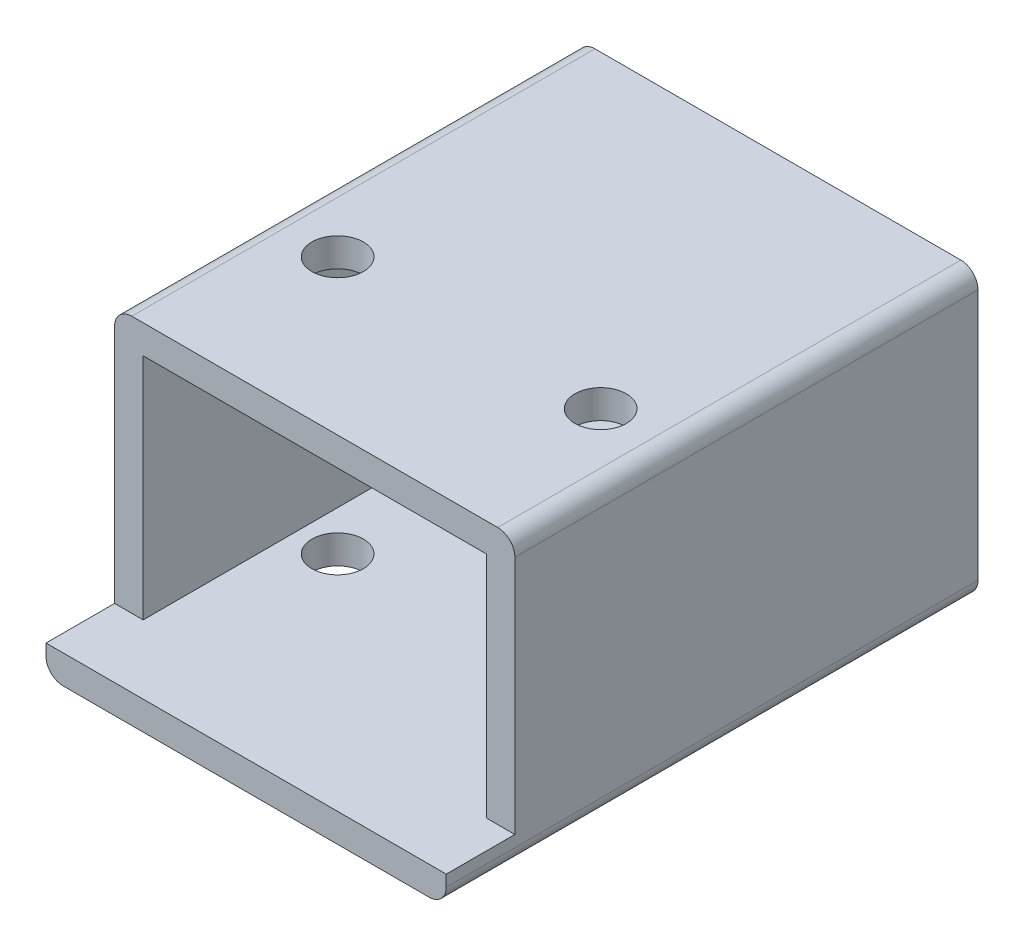
ISO-10303-21;
HEADER;
FILE_DESCRIPTION(('STEP AP214'),'2;1');
FILE_NAME('part.step','',(''),(''),'','','');
FILE_SCHEMA(('AUTOMOTIVE_DESIGN { 1 0 10303 214 1 1 1 1 }'));
ENDSEC;
DATA;
#1=APPLICATION_CONTEXT('core data for automotive mechanical design processes');
#2=APPLICATION_PROTOCOL_DEFINITION('international standard','automotive_design',2000,#1);
#3=PRODUCT_CONTEXT('',#1,'mechanical');
#4=PRODUCT('Part','Part','',(#3));
#5=PRODUCT_RELATED_PRODUCT_CATEGORY('part','',(#4));
#6=PRODUCT_DEFINITION_FORMATION('','',#4);
#7=PRODUCT_DEFINITION_CONTEXT('part definition',#1,'design');
#8=PRODUCT_DEFINITION('design','',#6,#7);
#9=PRODUCT_DEFINITION_SHAPE('','',#8);
#10=(LENGTH_UNIT() NAMED_UNIT(*) SI_UNIT(.MILLI.,.METRE.));
#11=(NAMED_UNIT(*) PLANE_ANGLE_UNIT() SI_UNIT($,.RADIAN.));
#12=(NAMED_UNIT(*) SI_UNIT($,.STERADIAN.) SOLID_ANGLE_UNIT());
#13=UNCERTAINTY_MEASURE_WITH_UNIT(LENGTH_MEASURE(1.E-05),#10,'distance_accuracy_value','');
#14=(GEOMETRIC_REPRESENTATION_CONTEXT(3) GLOBAL_UNCERTAINTY_ASSIGNED_CONTEXT((#13)) GLOBAL_UNIT_ASSIGNED_CONTEXT((#10,
#11,#12)) REPRESENTATION_CONTEXT('',''));
#15=CARTESIAN_POINT('',(0.,0.,0.));
#16=DIRECTION('',(0.,0.,1.));
#17=DIRECTION('',(1.,0.,0.));
#18=AXIS2_PLACEMENT_3D('',#15,#16,#17);
#19=CARTESIAN_POINT('',(0.,0.,5.));
#20=DIRECTION('',(0.,0.,1.));
#21=DIRECTION('',(1.,0.,0.));
#22=AXIS2_PLACEMENT_3D('',#19,#20,#21);
#23=PLANE('',#22);
#24=CARTESIAN_POINT('',(-19.,11.,5.));
#25=DIRECTION('',(0.,0.,1.));
#26=DIRECTION('',(1.,0.,0.));
#27=AXIS2_PLACEMENT_3D('',#24,#25,#26);
#28=CIRCLE('',#27,5.5665);
#29=CARTESIAN_POINT('',(-13.4335,11.,5.));
#30=VERTEX_POINT('',#29);
#31=EDGE_CURVE('E537',#30,#30,#28,.T.);
#32=ORIENTED_EDGE('',*,*,#31,.F.);
#33=EDGE_LOOP('',(#32));
#34=FACE_BOUND('',#33,.T.);
#35=CARTESIAN_POINT('',(19.,11.,5.));
#36=DIRECTION('',(0.,0.,1.));
#37=DIRECTION('',(1.,0.,0.));
#38=AXIS2_PLACEMENT_3D('',#35,#36,#37);
#39=CIRCLE('',#38,5.5665);
#40=CARTESIAN_POINT('',(24.5665,11.,5.));
#41=VERTEX_POINT('',#40);
#42=EDGE_CURVE('E551',#41,#41,#39,.T.);
#43=ORIENTED_EDGE('',*,*,#42,.F.);
#44=EDGE_LOOP('',(#43));
#45=FACE_BOUND('',#44,.T.);
#46=CARTESIAN_POINT('',(19.,-11.,5.));
#47=DIRECTION('',(0.,0.,1.));
#48=DIRECTION('',(1.,0.,0.));
#49=AXIS2_PLACEMENT_3D('',#46,#47,#48);
#50=CIRCLE('',#49,5.5665);
#51=CARTESIAN_POINT('',(24.5665,-11.,5.));
#52=VERTEX_POINT('',#51);
#53=EDGE_CURVE('E309',#52,#52,#50,.T.);
#54=ORIENTED_EDGE('',*,*,#53,.F.);
#55=EDGE_LOOP('',(#54));
#56=FACE_BOUND('',#55,.T.);
#57=CARTESIAN_POINT('',(-19.,-11.,5.));
#58=DIRECTION('',(0.,0.,1.));
#59=DIRECTION('',(1.,0.,0.));
#60=AXIS2_PLACEMENT_3D('',#57,#58,#59);
#61=CIRCLE('',#60,5.5665);
#62=CARTESIAN_POINT('',(-13.4335,-11.,5.));
#63=VERTEX_POINT('',#62);
#64=EDGE_CURVE('E304',#63,#63,#61,.T.);
#65=ORIENTED_EDGE('',*,*,#64,.F.);
#66=EDGE_LOOP('',(#65));
#67=FACE_BOUND('',#66,.T.);
#68=DIRECTION('',(1.,0.,0.));
#69=VECTOR('',#68,1.);
#70=CARTESIAN_POINT('',(-30.,20.,5.));
#71=LINE('',#70,#69);
#72=CARTESIAN_POINT('',(-30.,20.,5.));
#73=VERTEX_POINT('',#72);
#74=CARTESIAN_POINT('',(30.,20.,5.));
#75=VERTEX_POINT('',#74);
#76=EDGE_CURVE('E192',#73,#75,#71,.T.);
#77=ORIENTED_EDGE('',*,*,#76,.F.);
#78=DIRECTION('',(0.,1.,0.));
#79=VECTOR('',#78,1.);
#80=CARTESIAN_POINT('',(-30.,20.,5.));
#81=LINE('',#80,#79);
#82=CARTESIAN_POINT('',(-30.,-20.,5.));
#83=VERTEX_POINT('',#82);
#84=EDGE_CURVE('E177',#83,#73,#81,.T.);
#85=ORIENTED_EDGE('',*,*,#84,.F.);
#86=DIRECTION('',(-1.,0.,0.));
#87=VECTOR('',#86,1.);
#88=CARTESIAN_POINT('',(35.0000000000001,-20.,5.));
#89=LINE('',#88,#87);
#90=CARTESIAN_POINT('',(30.,-20.,5.));
#91=VERTEX_POINT('',#90);
#92=EDGE_CURVE('E175',#91,#83,#89,.T.);
#93=ORIENTED_EDGE('',*,*,#92,.F.);
#94=DIRECTION('',(0.,-1.,0.));
#95=VECTOR('',#94,1.);
#96=CARTESIAN_POINT('',(30.,20.,5.));
#97=LINE('',#96,#95);
#98=EDGE_CURVE('E196',#75,#91,#97,.T.);
#99=ORIENTED_EDGE('',*,*,#98,.F.);
#100=EDGE_LOOP('',(#77,#85,#93,#99));
#101=FACE_BOUND('',#100,.T.);
#102=ADVANCED_FACE('F43',(#34,#45,#56,#67,#101),#23,.T.);
#103=CARTESIAN_POINT('',(35.0000000000001,-20.,93.));
#104=DIRECTION('',(0.,-1.,0.));
#105=DIRECTION('',(1.,0.,0.));
#106=AXIS2_PLACEMENT_3D('',#103,#104,#105);
#107=PLANE('',#106);
#108=CARTESIAN_POINT('',(23.0000000000001,-20.,54.));
#109=DIRECTION('',(0.,-1.,0.));
#110=DIRECTION('',(1.,0.,0.));
#111=AXIS2_PLACEMENT_3D('',#108,#109,#110);
#112=CIRCLE('',#111,4.50000000000199);
#113=CARTESIAN_POINT('',(27.5000000000021,-20.,54.));
#114=VERTEX_POINT('',#113);
#115=EDGE_CURVE('E178',#114,#114,#112,.T.);
#116=ORIENTED_EDGE('',*,*,#115,.T.);
#117=EDGE_LOOP('',(#116));
#118=FACE_BOUND('',#117,.T.);
#119=CARTESIAN_POINT('',(-22.9999999999999,-20.,54.));
#120=DIRECTION('',(0.,-1.,0.));
#121=DIRECTION('',(1.,0.,0.));
#122=AXIS2_PLACEMENT_3D('',#119,#120,#121);
#123=CIRCLE('',#122,4.500000000002);
#124=CARTESIAN_POINT('',(-18.4999999999979,-20.,54.));
#125=VERTEX_POINT('',#124);
#126=EDGE_CURVE('E250',#125,#125,#123,.T.);
#127=ORIENTED_EDGE('',*,*,#126,.T.);
#128=EDGE_LOOP('',(#127));
#129=FACE_BOUND('',#128,.T.);
#130=DIRECTION('',(0.,0.,-1.));
#131=VECTOR('',#130,1.);
#132=CARTESIAN_POINT('',(30.,-20.,164.216584885466));
#133=LINE('',#132,#131);
#134=CARTESIAN_POINT('',(30.,-20.,80.9999999999999));
#135=VERTEX_POINT('',#134);
#136=EDGE_CURVE('E197',#135,#91,#133,.T.);
#137=ORIENTED_EDGE('',*,*,#136,.T.);
#138=ORIENTED_EDGE('',*,*,#92,.T.);
#139=DIRECTION('',(0.,0.,-1.));
#140=VECTOR('',#139,1.);
#141=CARTESIAN_POINT('',(-30.,-20.,164.216584885466));
#142=LINE('',#141,#140);
#143=CARTESIAN_POINT('',(-30.,-20.,80.9999999999999));
#144=VERTEX_POINT('',#143);
#145=EDGE_CURVE('E154',#144,#83,#142,.T.);
#146=ORIENTED_EDGE('',*,*,#145,.F.);
#147=DIRECTION('',(1.,0.,0.));
#148=VECTOR('',#147,1.);
#149=CARTESIAN_POINT('',(-35.0000000000001,-20.,80.9999999999999));
#150=LINE('',#149,#148);
#151=CARTESIAN_POINT('',(-35.0000000000001,-20.,80.9999999999999));
#152=VERTEX_POINT('',#151);
#153=EDGE_CURVE('E160',#152,#144,#150,.T.);
#154=ORIENTED_EDGE('',*,*,#153,.F.);
#155=DIRECTION('',(0.,0.,-1.));
#156=VECTOR('',#155,1.);
#157=CARTESIAN_POINT('',(-35.0000000000001,-20.,93.));
#158=LINE('',#157,#156);
#159=CARTESIAN_POINT('',(-35.0000000000001,-20.,93.));
#160=VERTEX_POINT('',#159);
#161=EDGE_CURVE('E214',#160,#152,#158,.T.);
#162=ORIENTED_EDGE('',*,*,#161,.F.);
#163=DIRECTION('',(-1.,0.,0.));
#164=VECTOR('',#163,1.);
#165=CARTESIAN_POINT('',(35.0000000000001,-20.,93.));
#166=LINE('',#165,#164);
#167=CARTESIAN_POINT('',(35.0000000000001,-20.,93.));
#168=VERTEX_POINT('',#167);
#169=EDGE_CURVE('E203',#168,#160,#166,.T.);
#170=ORIENTED_EDGE('',*,*,#169,.F.);
#171=DIRECTION('',(0.,0.,-1.));
#172=VECTOR('',#171,1.);
#173=CARTESIAN_POINT('',(35.0000000000001,-20.,93.));
#174=LINE('',#173,#172);
#175=CARTESIAN_POINT('',(35.0000000000001,-20.,80.9999999999999));
#176=VERTEX_POINT('',#175);
#177=EDGE_CURVE('E220',#168,#176,#174,.T.);
#178=ORIENTED_EDGE('',*,*,#177,.T.);
#179=DIRECTION('',(1.,0.,0.));
#180=VECTOR('',#179,1.);
#181=CARTESIAN_POINT('',(35.0000000000001,-20.,80.9999999999999));
#182=LINE('',#181,#180);
#183=EDGE_CURVE('E375',#135,#176,#182,.T.);
#184=ORIENTED_EDGE('',*,*,#183,.F.);
#185=EDGE_LOOP('',(#137,#138,#146,#154,#162,#170,#178,#184));
#186=FACE_BOUND('',#185,.T.);
#187=ADVANCED_FACE('F173',(#118,#129,#186),#107,.F.);
#188=CARTESIAN_POINT('',(-35.0000000000001,-25.,5.));
#189=DIRECTION('',(1.,0.,0.));
#190=DIRECTION('',(0.,0.,-1.));
#191=AXIS2_PLACEMENT_3D('',#188,#189,#190);
#192=PLANE('',#191);
#193=DIRECTION('',(0.,-1.,0.));
#194=VECTOR('',#193,1.);
#195=CARTESIAN_POINT('',(-35.0000000000001,20.,80.9999999999999));
#196=LINE('',#195,#194);
#197=CARTESIAN_POINT('',(-35.0000000000001,22.,80.9999999999999));
#198=VERTEX_POINT('',#197);
#199=EDGE_CURVE('E165',#198,#152,#196,.T.);
#200=ORIENTED_EDGE('',*,*,#199,.F.);
#201=DIRECTION('',(0.,0.,-1.));
#202=VECTOR('',#201,1.);
#203=CARTESIAN_POINT('',(-35.0000000000001,22.,5.));
#204=LINE('',#203,#202);
#205=CARTESIAN_POINT('',(-35.0000000000001,22.,0.));
#206=VERTEX_POINT('',#205);
#207=EDGE_CURVE('E11',#198,#206,#204,.T.);
#208=ORIENTED_EDGE('',*,*,#207,.T.);
#209=DIRECTION('',(0.,-1.,0.));
#210=VECTOR('',#209,1.);
#211=CARTESIAN_POINT('',(-35.0000000000001,-25.,0.));
#212=LINE('',#211,#210);
#213=CARTESIAN_POINT('',(-35.0000000000001,-22.,0.));
#214=VERTEX_POINT('',#213);
#215=EDGE_CURVE('E224',#206,#214,#212,.T.);
#216=ORIENTED_EDGE('',*,*,#215,.T.);
#217=DIRECTION('',(0.,0.,-1.));
#218=VECTOR('',#217,1.);
#219=CARTESIAN_POINT('',(-35.0000000000001,-22.,5.));
#220=LINE('',#219,#218);
#221=CARTESIAN_POINT('',(-35.0000000000001,-22.,93.));
#222=VERTEX_POINT('',#221);
#223=EDGE_CURVE('E53',#214,#222,#220,.F.);
#224=ORIENTED_EDGE('',*,*,#223,.T.);
#225=DIRECTION('',(0.,-1.,0.));
#226=VECTOR('',#225,1.);
#227=CARTESIAN_POINT('',(-35.0000000000001,-25.,93.));
#228=LINE('',#227,#226);
#229=EDGE_CURVE('E206',#160,#222,#228,.T.);
#230=ORIENTED_EDGE('',*,*,#229,.F.);
#231=ORIENTED_EDGE('',*,*,#161,.T.);
#232=EDGE_LOOP('',(#200,#208,#216,#224,#230,#231));
#233=FACE_BOUND('',#232,.T.);
#234=ADVANCED_FACE('F393',(#233),#192,.F.);
#235=CARTESIAN_POINT('',(35.0000000000001,-25.,5.));
#236=DIRECTION('',(0.,1.,0.));
#237=DIRECTION('',(0.,0.,1.));
#238=AXIS2_PLACEMENT_3D('',#235,#236,#237);
#239=PLANE('',#238);
#240=CARTESIAN_POINT('',(23.0000000000001,-25.,54.));
#241=DIRECTION('',(0.,1.,0.));
#242=DIRECTION('',(0.,0.,1.));
#243=AXIS2_PLACEMENT_3D('',#240,#241,#242);
#244=CIRCLE('',#243,4.50000000000199);
#245=CARTESIAN_POINT('',(23.0000000000001,-25.,58.500000000002));
#246=VERTEX_POINT('',#245);
#247=EDGE_CURVE('E184',#246,#246,#244,.T.);
#248=ORIENTED_EDGE('',*,*,#247,.T.);
#249=EDGE_LOOP('',(#248));
#250=FACE_BOUND('',#249,.T.);
#251=CARTESIAN_POINT('',(-22.9999999999999,-25.,54.));
#252=DIRECTION('',(0.,1.,0.));
#253=DIRECTION('',(0.,0.,1.));
#254=AXIS2_PLACEMENT_3D('',#251,#252,#253);
#255=CIRCLE('',#254,4.500000000002);
#256=CARTESIAN_POINT('',(-22.9999999999999,-25.,58.500000000002));
#257=VERTEX_POINT('',#256);
#258=EDGE_CURVE('E244',#257,#257,#255,.T.);
#259=ORIENTED_EDGE('',*,*,#258,.T.);
#260=EDGE_LOOP('',(#259));
#261=FACE_BOUND('',#260,.T.);
#262=DIRECTION('',(1.,0.,0.));
#263=VECTOR('',#262,1.);
#264=CARTESIAN_POINT('',(35.0000000000001,-25.,0.));
#265=LINE('',#264,#263);
#266=CARTESIAN_POINT('',(-32.0000000000001,-25.,0.));
#267=VERTEX_POINT('',#266);
#268=CARTESIAN_POINT('',(32.0000000000001,-25.,0.));
#269=VERTEX_POINT('',#268);
#270=EDGE_CURVE('E228',#267,#269,#265,.T.);
#271=ORIENTED_EDGE('',*,*,#270,.T.);
#272=DIRECTION('',(0.,0.,-1.));
#273=VECTOR('',#272,1.);
#274=CARTESIAN_POINT('',(32.0000000000001,-25.,5.));
#275=LINE('',#274,#273);
#276=CARTESIAN_POINT('',(32.0000000000001,-25.,93.));
#277=VERTEX_POINT('',#276);
#278=EDGE_CURVE('E273',#269,#277,#275,.F.);
#279=ORIENTED_EDGE('',*,*,#278,.T.);
#280=DIRECTION('',(1.,0.,0.));
#281=VECTOR('',#280,1.);
#282=CARTESIAN_POINT('',(35.0000000000001,-25.,93.));
#283=LINE('',#282,#281);
#284=CARTESIAN_POINT('',(-32.0000000000001,-25.,93.));
#285=VERTEX_POINT('',#284);
#286=EDGE_CURVE('E210',#285,#277,#283,.T.);
#287=ORIENTED_EDGE('',*,*,#286,.F.);
#288=DIRECTION('',(0.,0.,-1.));
#289=VECTOR('',#288,1.);
#290=CARTESIAN_POINT('',(-32.0000000000001,-25.,5.));
#291=LINE('',#290,#289);
#292=EDGE_CURVE('E269',#285,#267,#291,.T.);
#293=ORIENTED_EDGE('',*,*,#292,.T.);
#294=EDGE_LOOP('',(#271,#279,#287,#293));
#295=FACE_BOUND('',#294,.T.);
#296=ADVANCED_FACE('F405',(#250,#261,#295),#239,.F.);
#297=CARTESIAN_POINT('',(35.0000000000001,-25.,5.));
#298=DIRECTION('',(-1.,0.,0.));
#299=DIRECTION('',(0.,0.,1.));
#300=AXIS2_PLACEMENT_3D('',#297,#298,#299);
#301=PLANE('',#300);
#302=DIRECTION('',(0.,1.,0.));
#303=VECTOR('',#302,1.);
#304=CARTESIAN_POINT('',(35.0000000000001,-25.,93.));
#305=LINE('',#304,#303);
#306=CARTESIAN_POINT('',(35.0000000000001,-22.,93.));
#307=VERTEX_POINT('',#306);
#308=EDGE_CURVE('E200',#307,#168,#305,.T.);
#309=ORIENTED_EDGE('',*,*,#308,.F.);
#310=DIRECTION('',(0.,0.,-1.));
#311=VECTOR('',#310,1.);
#312=CARTESIAN_POINT('',(35.0000000000001,-22.,5.));
#313=LINE('',#312,#311);
#314=CARTESIAN_POINT('',(35.0000000000001,-22.,0.));
#315=VERTEX_POINT('',#314);
#316=EDGE_CURVE('E253',#307,#315,#313,.T.);
#317=ORIENTED_EDGE('',*,*,#316,.T.);
#318=DIRECTION('',(0.,1.,0.));
#319=VECTOR('',#318,1.);
#320=CARTESIAN_POINT('',(35.0000000000001,-25.,0.));
#321=LINE('',#320,#319);
#322=CARTESIAN_POINT('',(35.0000000000001,22.,0.));
#323=VERTEX_POINT('',#322);
#324=EDGE_CURVE('E232',#315,#323,#321,.T.);
#325=ORIENTED_EDGE('',*,*,#324,.T.);
#326=DIRECTION('',(0.,0.,-1.));
#327=VECTOR('',#326,1.);
#328=CARTESIAN_POINT('',(35.0000000000001,22.,5.));
#329=LINE('',#328,#327);
#330=CARTESIAN_POINT('',(35.0000000000001,22.,80.9999999999999));
#331=VERTEX_POINT('',#330);
#332=EDGE_CURVE('E239',#323,#331,#329,.F.);
#333=ORIENTED_EDGE('',*,*,#332,.T.);
#334=DIRECTION('',(0.,1.,0.));
#335=VECTOR('',#334,1.);
#336=CARTESIAN_POINT('',(35.0000000000001,25.,80.9999999999999));
#337=LINE('',#336,#335);
#338=EDGE_CURVE('E217',#176,#331,#337,.T.);
#339=ORIENTED_EDGE('',*,*,#338,.F.);
#340=ORIENTED_EDGE('',*,*,#177,.F.);
#341=EDGE_LOOP('',(#309,#317,#325,#333,#339,#340));
#342=FACE_BOUND('',#341,.T.);
#343=ADVANCED_FACE('F415',(#342),#301,.F.);
#344=CARTESIAN_POINT('',(35.0000000000001,25.,5.));
#345=DIRECTION('',(0.,-1.,0.));
#346=DIRECTION('',(0.,0.,-1.));
#347=AXIS2_PLACEMENT_3D('',#344,#345,#346);
#348=PLANE('',#347);
#349=CARTESIAN_POINT('',(23.0000000000001,25.,54.));
#350=DIRECTION('',(0.,1.,0.));
#351=DIRECTION('',(0.,0.,1.));
#352=AXIS2_PLACEMENT_3D('',#349,#350,#351);
#353=CIRCLE('',#352,4.50000000000199);
#354=CARTESIAN_POINT('',(23.0000000000001,25.,58.500000000002));
#355=VERTEX_POINT('',#354);
#356=EDGE_CURVE('E245',#355,#355,#353,.T.);
#357=ORIENTED_EDGE('',*,*,#356,.F.);
#358=EDGE_LOOP('',(#357));
#359=FACE_BOUND('',#358,.T.);
#360=CARTESIAN_POINT('',(-22.9999999999999,25.,54.));
#361=DIRECTION('',(0.,1.,0.));
#362=DIRECTION('',(0.,0.,1.));
#363=AXIS2_PLACEMENT_3D('',#360,#361,#362);
#364=CIRCLE('',#363,4.500000000002);
#365=CARTESIAN_POINT('',(-22.9999999999999,25.,58.500000000002));
#366=VERTEX_POINT('',#365);
#367=EDGE_CURVE('E299',#366,#366,#364,.T.);
#368=ORIENTED_EDGE('',*,*,#367,.F.);
#369=EDGE_LOOP('',(#368));
#370=FACE_BOUND('',#369,.T.);
#371=DIRECTION('',(-1.,0.,0.));
#372=VECTOR('',#371,1.);
#373=CARTESIAN_POINT('',(-35.0000000000001,25.,80.9999999999999));
#374=LINE('',#373,#372);
#375=CARTESIAN_POINT('',(32.0000000000001,25.,80.9999999999999));
#376=VERTEX_POINT('',#375);
#377=CARTESIAN_POINT('',(-32.0000000000001,25.,80.9999999999999));
#378=VERTEX_POINT('',#377);
#379=EDGE_CURVE('E188',#376,#378,#374,.T.);
#380=ORIENTED_EDGE('',*,*,#379,.F.);
#381=DIRECTION('',(0.,0.,-1.));
#382=VECTOR('',#381,1.);
#383=CARTESIAN_POINT('',(32.0000000000001,25.,5.));
#384=LINE('',#383,#382);
#385=CARTESIAN_POINT('',(32.0000000000001,25.,0.));
#386=VERTEX_POINT('',#385);
#387=EDGE_CURVE('E284',#376,#386,#384,.T.);
#388=ORIENTED_EDGE('',*,*,#387,.T.);
#389=DIRECTION('',(-1.,0.,0.));
#390=VECTOR('',#389,1.);
#391=CARTESIAN_POINT('',(35.0000000000001,25.,0.));
#392=LINE('',#391,#390);
#393=CARTESIAN_POINT('',(-32.0000000000001,25.,0.));
#394=VERTEX_POINT('',#393);
#395=EDGE_CURVE('E236',#386,#394,#392,.T.);
#396=ORIENTED_EDGE('',*,*,#395,.T.);
#397=DIRECTION('',(0.,0.,-1.));
#398=VECTOR('',#397,1.);
#399=CARTESIAN_POINT('',(-32.0000000000001,25.,5.));
#400=LINE('',#399,#398);
#401=EDGE_CURVE('E69',#394,#378,#400,.F.);
#402=ORIENTED_EDGE('',*,*,#401,.T.);
#403=EDGE_LOOP('',(#380,#388,#396,#402));
#404=FACE_BOUND('',#403,.T.);
#405=ADVANCED_FACE('F420',(#359,#370,#404),#348,.F.);
#406=CARTESIAN_POINT('',(0.,0.,0.));
#407=DIRECTION('',(0.,0.,1.));
#408=DIRECTION('',(1.,0.,0.));
#409=AXIS2_PLACEMENT_3D('',#406,#407,#408);
#410=PLANE('',#409);
#411=CARTESIAN_POINT('',(-19.,11.,0.));
#412=DIRECTION('',(0.,0.,1.));
#413=DIRECTION('',(1.,0.,0.));
#414=AXIS2_PLACEMENT_3D('',#411,#412,#413);
#415=CIRCLE('',#414,2.25);
#416=CARTESIAN_POINT('',(-16.75,11.,0.));
#417=VERTEX_POINT('',#416);
#418=EDGE_CURVE('E47',#417,#417,#415,.T.);
#419=ORIENTED_EDGE('',*,*,#418,.T.);
#420=EDGE_LOOP('',(#419));
#421=FACE_BOUND('',#420,.T.);
#422=CARTESIAN_POINT('',(19.,11.,0.));
#423=DIRECTION('',(0.,0.,1.));
#424=DIRECTION('',(1.,0.,0.));
#425=AXIS2_PLACEMENT_3D('',#422,#423,#424);
#426=CIRCLE('',#425,2.25);
#427=CARTESIAN_POINT('',(21.25,11.,0.));
#428=VERTEX_POINT('',#427);
#429=EDGE_CURVE('E306',#428,#428,#426,.T.);
#430=ORIENTED_EDGE('',*,*,#429,.T.);
#431=EDGE_LOOP('',(#430));
#432=FACE_BOUND('',#431,.T.);
#433=CARTESIAN_POINT('',(19.,-11.,0.));
#434=DIRECTION('',(0.,0.,1.));
#435=DIRECTION('',(1.,0.,0.));
#436=AXIS2_PLACEMENT_3D('',#433,#434,#435);
#437=CIRCLE('',#436,2.25);
#438=CARTESIAN_POINT('',(21.25,-11.,0.));
#439=VERTEX_POINT('',#438);
#440=EDGE_CURVE('E301',#439,#439,#437,.T.);
#441=ORIENTED_EDGE('',*,*,#440,.T.);
#442=EDGE_LOOP('',(#441));
#443=FACE_BOUND('',#442,.T.);
#444=CARTESIAN_POINT('',(-19.,-11.,0.));
#445=DIRECTION('',(0.,0.,1.));
#446=DIRECTION('',(1.,0.,0.));
#447=AXIS2_PLACEMENT_3D('',#444,#445,#446);
#448=CIRCLE('',#447,2.25);
#449=CARTESIAN_POINT('',(-16.75,-11.,0.));
#450=VERTEX_POINT('',#449);
#451=EDGE_CURVE('E295',#450,#450,#448,.T.);
#452=ORIENTED_EDGE('',*,*,#451,.T.);
#453=EDGE_LOOP('',(#452));
#454=FACE_BOUND('',#453,.T.);
#455=ORIENTED_EDGE('',*,*,#324,.F.);
#456=CARTESIAN_POINT('',(32.0000000000001,-22.,0.));
#457=DIRECTION('',(0.,0.,1.));
#458=DIRECTION('',(1.,0.,0.));
#459=AXIS2_PLACEMENT_3D('',#456,#457,#458);
#460=CIRCLE('',#459,3.);
#461=EDGE_CURVE('E266',#315,#269,#460,.F.);
#462=ORIENTED_EDGE('',*,*,#461,.T.);
#463=ORIENTED_EDGE('',*,*,#270,.F.);
#464=CARTESIAN_POINT('',(-32.0000000000001,-22.,0.));
#465=DIRECTION('',(0.,0.,1.));
#466=DIRECTION('',(1.,0.,0.));
#467=AXIS2_PLACEMENT_3D('',#464,#465,#466);
#468=CIRCLE('',#467,3.);
#469=EDGE_CURVE('E257',#267,#214,#468,.F.);
#470=ORIENTED_EDGE('',*,*,#469,.T.);
#471=ORIENTED_EDGE('',*,*,#215,.F.);
#472=CARTESIAN_POINT('',(-32.0000000000001,22.,0.));
#473=DIRECTION('',(0.,0.,1.));
#474=DIRECTION('',(1.,0.,0.));
#475=AXIS2_PLACEMENT_3D('',#472,#473,#474);
#476=CIRCLE('',#475,3.);
#477=EDGE_CURVE('E260',#206,#394,#476,.F.);
#478=ORIENTED_EDGE('',*,*,#477,.T.);
#479=ORIENTED_EDGE('',*,*,#395,.F.);
#480=CARTESIAN_POINT('',(32.0000000000001,22.,0.));
#481=DIRECTION('',(0.,0.,1.));
#482=DIRECTION('',(1.,0.,0.));
#483=AXIS2_PLACEMENT_3D('',#480,#481,#482);
#484=CIRCLE('',#483,3.);
#485=EDGE_CURVE('E263',#386,#323,#484,.F.);
#486=ORIENTED_EDGE('',*,*,#485,.T.);
#487=EDGE_LOOP('',(#455,#462,#463,#470,#471,#478,#479,#486));
#488=FACE_BOUND('',#487,.T.);
#489=ADVANCED_FACE('F397',(#421,#432,#443,#454,#488),#410,.F.);
#490=CARTESIAN_POINT('',(0.,0.,93.));
#491=DIRECTION('',(0.,0.,1.));
#492=DIRECTION('',(1.,0.,0.));
#493=AXIS2_PLACEMENT_3D('',#490,#491,#492);
#494=PLANE('',#493);
#495=ORIENTED_EDGE('',*,*,#286,.T.);
#496=CARTESIAN_POINT('',(32.0000000000001,-22.,93.));
#497=DIRECTION('',(0.,0.,1.));
#498=DIRECTION('',(1.,0.,0.));
#499=AXIS2_PLACEMENT_3D('',#496,#497,#498);
#500=CIRCLE('',#499,3.);
#501=EDGE_CURVE('E279',#277,#307,#500,.T.);
#502=ORIENTED_EDGE('',*,*,#501,.T.);
#503=ORIENTED_EDGE('',*,*,#308,.T.);
#504=ORIENTED_EDGE('',*,*,#169,.T.);
#505=ORIENTED_EDGE('',*,*,#229,.T.);
#506=CARTESIAN_POINT('',(-32.0000000000001,-22.,93.));
#507=DIRECTION('',(0.,0.,1.));
#508=DIRECTION('',(1.,0.,0.));
#509=AXIS2_PLACEMENT_3D('',#506,#507,#508);
#510=CIRCLE('',#509,3.);
#511=EDGE_CURVE('E276',#222,#285,#510,.T.);
#512=ORIENTED_EDGE('',*,*,#511,.T.);
#513=EDGE_LOOP('',(#495,#502,#503,#504,#505,#512));
#514=FACE_BOUND('',#513,.T.);
#515=ADVANCED_FACE('F409',(#514),#494,.T.);
#516=CARTESIAN_POINT('',(-30.,20.,164.216584885466));
#517=DIRECTION('',(-1.,0.,0.));
#518=DIRECTION('',(0.,0.,1.));
#519=AXIS2_PLACEMENT_3D('',#516,#517,#518);
#520=PLANE('',#519);
#521=DIRECTION('',(0.,1.,0.));
#522=VECTOR('',#521,1.);
#523=CARTESIAN_POINT('',(-30.,20.,80.9999999999999));
#524=LINE('',#523,#522);
#525=CARTESIAN_POINT('',(-30.,20.,80.9999999999999));
#526=VERTEX_POINT('',#525);
#527=EDGE_CURVE('E149',#144,#526,#524,.T.);
#528=ORIENTED_EDGE('',*,*,#527,.F.);
#529=ORIENTED_EDGE('',*,*,#145,.T.);
#530=ORIENTED_EDGE('',*,*,#84,.T.);
#531=DIRECTION('',(0.,0.,-1.));
#532=VECTOR('',#531,1.);
#533=CARTESIAN_POINT('',(-30.,20.,164.216584885466));
#534=LINE('',#533,#532);
#535=EDGE_CURVE('E156',#526,#73,#534,.T.);
#536=ORIENTED_EDGE('',*,*,#535,.F.);
#537=EDGE_LOOP('',(#528,#529,#530,#536));
#538=FACE_BOUND('',#537,.T.);
#539=ADVANCED_FACE('F151',(#538),#520,.F.);
#540=CARTESIAN_POINT('',(-30.,20.,164.216584885466));
#541=DIRECTION('',(0.,1.,0.));
#542=DIRECTION('',(0.,0.,1.));
#543=AXIS2_PLACEMENT_3D('',#540,#541,#542);
#544=PLANE('',#543);
#545=CARTESIAN_POINT('',(23.0000000000001,20.,54.));
#546=DIRECTION('',(0.,1.,0.));
#547=DIRECTION('',(0.,0.,1.));
#548=AXIS2_PLACEMENT_3D('',#545,#546,#547);
#549=CIRCLE('',#548,4.50000000000199);
#550=CARTESIAN_POINT('',(23.0000000000001,20.,58.500000000002));
#551=VERTEX_POINT('',#550);
#552=EDGE_CURVE('E246',#551,#551,#549,.T.);
#553=ORIENTED_EDGE('',*,*,#552,.T.);
#554=EDGE_LOOP('',(#553));
#555=FACE_BOUND('',#554,.T.);
#556=CARTESIAN_POINT('',(-22.9999999999999,20.,54.));
#557=DIRECTION('',(0.,1.,0.));
#558=DIRECTION('',(0.,0.,1.));
#559=AXIS2_PLACEMENT_3D('',#556,#557,#558);
#560=CIRCLE('',#559,4.500000000002);
#561=CARTESIAN_POINT('',(-22.9999999999999,20.,58.500000000002));
#562=VERTEX_POINT('',#561);
#563=EDGE_CURVE('E240',#562,#562,#560,.T.);
#564=ORIENTED_EDGE('',*,*,#563,.T.);
#565=EDGE_LOOP('',(#564));
#566=FACE_BOUND('',#565,.T.);
#567=DIRECTION('',(1.,0.,0.));
#568=VECTOR('',#567,1.);
#569=CARTESIAN_POINT('',(-30.,20.,80.9999999999999));
#570=LINE('',#569,#568);
#571=CARTESIAN_POINT('',(30.,20.,80.9999999999999));
#572=VERTEX_POINT('',#571);
#573=EDGE_CURVE('E159',#526,#572,#570,.T.);
#574=ORIENTED_EDGE('',*,*,#573,.F.);
#575=ORIENTED_EDGE('',*,*,#535,.T.);
#576=ORIENTED_EDGE('',*,*,#76,.T.);
#577=DIRECTION('',(0.,0.,-1.));
#578=VECTOR('',#577,1.);
#579=CARTESIAN_POINT('',(30.,20.,164.216584885466));
#580=LINE('',#579,#578);
#581=EDGE_CURVE('E193',#572,#75,#580,.T.);
#582=ORIENTED_EDGE('',*,*,#581,.F.);
#583=EDGE_LOOP('',(#574,#575,#576,#582));
#584=FACE_BOUND('',#583,.T.);
#585=ADVANCED_FACE('F452',(#555,#566,#584),#544,.F.);
#586=CARTESIAN_POINT('',(30.,20.,164.216584885466));
#587=DIRECTION('',(1.,0.,0.));
#588=DIRECTION('',(0.,0.,-1.));
#589=AXIS2_PLACEMENT_3D('',#586,#587,#588);
#590=PLANE('',#589);
#591=DIRECTION('',(0.,-1.,0.));
#592=VECTOR('',#591,1.);
#593=CARTESIAN_POINT('',(30.,20.,80.9999999999999));
#594=LINE('',#593,#592);
#595=EDGE_CURVE('E379',#572,#135,#594,.T.);
#596=ORIENTED_EDGE('',*,*,#595,.F.);
#597=ORIENTED_EDGE('',*,*,#581,.T.);
#598=ORIENTED_EDGE('',*,*,#98,.T.);
#599=ORIENTED_EDGE('',*,*,#136,.F.);
#600=EDGE_LOOP('',(#596,#597,#598,#599));
#601=FACE_BOUND('',#600,.T.);
#602=ADVANCED_FACE('F449',(#601),#590,.F.);
#603=CARTESIAN_POINT('',(48.4999999999998,-19.8000000001548,80.9999999999999));
#604=DIRECTION('',(0.,0.,1.));
#605=DIRECTION('',(1.,0.,0.));
#606=AXIS2_PLACEMENT_3D('',#603,#604,#605);
#607=PLANE('',#606);
#608=ORIENTED_EDGE('',*,*,#338,.T.);
#609=CARTESIAN_POINT('',(32.0000000000001,22.,80.9999999999999));
#610=DIRECTION('',(0.,0.,1.));
#611=DIRECTION('',(1.,0.,0.));
#612=AXIS2_PLACEMENT_3D('',#609,#610,#611);
#613=CIRCLE('',#612,3.);
#614=EDGE_CURVE('E290',#331,#376,#613,.T.);
#615=ORIENTED_EDGE('',*,*,#614,.T.);
#616=ORIENTED_EDGE('',*,*,#379,.T.);
#617=CARTESIAN_POINT('',(-32.0000000000001,22.,80.9999999999999));
#618=DIRECTION('',(0.,0.,1.));
#619=DIRECTION('',(1.,0.,0.));
#620=AXIS2_PLACEMENT_3D('',#617,#618,#619);
#621=CIRCLE('',#620,3.);
#622=EDGE_CURVE('E61',#378,#198,#621,.T.);
#623=ORIENTED_EDGE('',*,*,#622,.T.);
#624=ORIENTED_EDGE('',*,*,#199,.T.);
#625=ORIENTED_EDGE('',*,*,#153,.T.);
#626=ORIENTED_EDGE('',*,*,#527,.T.);
#627=ORIENTED_EDGE('',*,*,#573,.T.);
#628=ORIENTED_EDGE('',*,*,#595,.T.);
#629=ORIENTED_EDGE('',*,*,#183,.T.);
#630=EDGE_LOOP('',(#608,#615,#616,#623,#624,#625,#626,#627,#628,#629));
#631=FACE_BOUND('',#630,.T.);
#632=ADVANCED_FACE('F164',(#631),#607,.T.);
#633=CARTESIAN_POINT('',(-22.9999999999999,-31.,54.));
#634=DIRECTION('',(0.,1.,0.));
#635=DIRECTION('',(0.,0.,1.));
#636=AXIS2_PLACEMENT_3D('',#633,#634,#635);
#637=CYLINDRICAL_SURFACE('',#636,4.500000000002);
#638=ORIENTED_EDGE('',*,*,#367,.T.);
#639=EDGE_LOOP('',(#638));
#640=FACE_BOUND('',#639,.T.);
#641=ORIENTED_EDGE('',*,*,#563,.F.);
#642=EDGE_LOOP('',(#641));
#643=FACE_BOUND('',#642,.T.);
#644=ADVANCED_FACE('F448',(#640,#643),#637,.F.);
#645=CARTESIAN_POINT('',(23.0000000000001,-31.,54.));
#646=DIRECTION('',(0.,1.,0.));
#647=DIRECTION('',(0.,0.,1.));
#648=AXIS2_PLACEMENT_3D('',#645,#646,#647);
#649=CYLINDRICAL_SURFACE('',#648,4.50000000000199);
#650=ORIENTED_EDGE('',*,*,#356,.T.);
#651=EDGE_LOOP('',(#650));
#652=FACE_BOUND('',#651,.T.);
#653=ORIENTED_EDGE('',*,*,#552,.F.);
#654=EDGE_LOOP('',(#653));
#655=FACE_BOUND('',#654,.T.);
#656=ADVANCED_FACE('F463',(#652,#655),#649,.F.);
#657=ORIENTED_EDGE('',*,*,#258,.F.);
#658=EDGE_LOOP('',(#657));
#659=FACE_BOUND('',#658,.T.);
#660=ORIENTED_EDGE('',*,*,#126,.F.);
#661=EDGE_LOOP('',(#660));
#662=FACE_BOUND('',#661,.T.);
#663=ADVANCED_FACE('F459',(#659,#662),#637,.F.);
#664=ORIENTED_EDGE('',*,*,#247,.F.);
#665=EDGE_LOOP('',(#664));
#666=FACE_BOUND('',#665,.T.);
#667=ORIENTED_EDGE('',*,*,#115,.F.);
#668=EDGE_LOOP('',(#667));
#669=FACE_BOUND('',#668,.T.);
#670=ADVANCED_FACE('F462',(#666,#669),#649,.F.);
#671=CARTESIAN_POINT('',(32.0000000000001,-22.,5.));
#672=DIRECTION('',(0.,0.,-1.));
#673=DIRECTION('',(-1.,0.,0.));
#674=AXIS2_PLACEMENT_3D('',#671,#672,#673);
#675=CYLINDRICAL_SURFACE('',#674,3.);
#676=ORIENTED_EDGE('',*,*,#501,.F.);
#677=ORIENTED_EDGE('',*,*,#278,.F.);
#678=ORIENTED_EDGE('',*,*,#461,.F.);
#679=ORIENTED_EDGE('',*,*,#316,.F.);
#680=EDGE_LOOP('',(#676,#677,#678,#679));
#681=FACE_BOUND('',#680,.T.);
#682=ADVANCED_FACE('F413',(#681),#675,.T.);
#683=CARTESIAN_POINT('',(32.0000000000001,22.,5.));
#684=DIRECTION('',(0.,0.,-1.));
#685=DIRECTION('',(-1.,0.,0.));
#686=AXIS2_PLACEMENT_3D('',#683,#684,#685);
#687=CYLINDRICAL_SURFACE('',#686,3.);
#688=ORIENTED_EDGE('',*,*,#614,.F.);
#689=ORIENTED_EDGE('',*,*,#332,.F.);
#690=ORIENTED_EDGE('',*,*,#485,.F.);
#691=ORIENTED_EDGE('',*,*,#387,.F.);
#692=EDGE_LOOP('',(#688,#689,#690,#691));
#693=FACE_BOUND('',#692,.T.);
#694=ADVANCED_FACE('F419',(#693),#687,.T.);
#695=CARTESIAN_POINT('',(-32.0000000000001,22.,5.));
#696=DIRECTION('',(0.,0.,-1.));
#697=DIRECTION('',(-1.,0.,0.));
#698=AXIS2_PLACEMENT_3D('',#695,#696,#697);
#699=CYLINDRICAL_SURFACE('',#698,3.);
#700=ORIENTED_EDGE('',*,*,#622,.F.);
#701=ORIENTED_EDGE('',*,*,#401,.F.);
#702=ORIENTED_EDGE('',*,*,#477,.F.);
#703=ORIENTED_EDGE('',*,*,#207,.F.);
#704=EDGE_LOOP('',(#700,#701,#702,#703));
#705=FACE_BOUND('',#704,.T.);
#706=ADVANCED_FACE('F390',(#705),#699,.T.);
#707=CARTESIAN_POINT('',(-32.0000000000001,-22.,5.));
#708=DIRECTION('',(0.,0.,-1.));
#709=DIRECTION('',(-1.,0.,0.));
#710=AXIS2_PLACEMENT_3D('',#707,#708,#709);
#711=CYLINDRICAL_SURFACE('',#710,3.);
#712=ORIENTED_EDGE('',*,*,#511,.F.);
#713=ORIENTED_EDGE('',*,*,#223,.F.);
#714=ORIENTED_EDGE('',*,*,#469,.F.);
#715=ORIENTED_EDGE('',*,*,#292,.F.);
#716=EDGE_LOOP('',(#712,#713,#714,#715));
#717=FACE_BOUND('',#716,.T.);
#718=ADVANCED_FACE('F45',(#717),#711,.T.);
#719=CARTESIAN_POINT('',(-19.,-11.,5.));
#720=DIRECTION('',(0.,0.,1.));
#721=DIRECTION('',(1.,0.,0.));
#722=AXIS2_PLACEMENT_3D('',#719,#720,#721);
#723=CYLINDRICAL_SURFACE('',#722,2.25);
#724=CARTESIAN_POINT('',(-19.,-11.,2.2));
#725=DIRECTION('',(0.,0.,1.));
#726=DIRECTION('',(1.,0.,0.));
#727=AXIS2_PLACEMENT_3D('',#724,#725,#726);
#728=CIRCLE('',#727,2.25);
#729=CARTESIAN_POINT('',(-16.75,-11.,2.2));
#730=VERTEX_POINT('',#729);
#731=EDGE_CURVE('E300',#730,#730,#728,.T.);
#732=ORIENTED_EDGE('',*,*,#731,.T.);
#733=EDGE_LOOP('',(#732));
#734=FACE_BOUND('',#733,.T.);
#735=ORIENTED_EDGE('',*,*,#451,.F.);
#736=EDGE_LOOP('',(#735));
#737=FACE_BOUND('',#736,.T.);
#738=ADVANCED_FACE('F468',(#734,#737),#723,.F.);
#739=CARTESIAN_POINT('',(-16.75,-11.,2.2));
#740=DIRECTION('',(0.,0.,-1.));
#741=DIRECTION('',(-1.,0.,0.));
#742=AXIS2_PLACEMENT_3D('',#739,#740,#741);
#743=PLANE('',#742);
#744=ORIENTED_EDGE('',*,*,#731,.F.);
#745=EDGE_LOOP('',(#744));
#746=FACE_BOUND('',#745,.T.);
#747=CARTESIAN_POINT('',(-19.,-11.,2.2));
#748=DIRECTION('',(0.,0.,1.));
#749=DIRECTION('',(1.,0.,0.));
#750=AXIS2_PLACEMENT_3D('',#747,#748,#749);
#751=CIRCLE('',#750,5.5415);
#752=CARTESIAN_POINT('',(-13.4585,-11.,2.2));
#753=VERTEX_POINT('',#752);
#754=EDGE_CURVE('E346',#753,#753,#751,.T.);
#755=ORIENTED_EDGE('',*,*,#754,.T.);
#756=EDGE_LOOP('',(#755));
#757=FACE_BOUND('',#756,.T.);
#758=ADVANCED_FACE('F471',(#746,#757),#743,.F.);
#759=CARTESIAN_POINT('',(-19.,-11.,5.));
#760=DIRECTION('',(0.,0.,1.));
#761=DIRECTION('',(1.,0.,0.));
#762=AXIS2_PLACEMENT_3D('',#759,#760,#761);
#763=CYLINDRICAL_SURFACE('',#762,5.5415);
#764=ORIENTED_EDGE('',*,*,#754,.F.);
#765=EDGE_LOOP('',(#764));
#766=FACE_BOUND('',#765,.T.);
#767=CARTESIAN_POINT('',(-19.,-11.,4.975));
#768=DIRECTION('',(0.,0.,1.));
#769=DIRECTION('',(1.,0.,0.));
#770=AXIS2_PLACEMENT_3D('',#767,#768,#769);
#771=CIRCLE('',#770,5.5415);
#772=CARTESIAN_POINT('',(-13.4585,-11.,4.975));
#773=VERTEX_POINT('',#772);
#774=EDGE_CURVE('E342',#773,#773,#771,.T.);
#775=ORIENTED_EDGE('',*,*,#774,.T.);
#776=EDGE_LOOP('',(#775));
#777=FACE_BOUND('',#776,.T.);
#778=ADVANCED_FACE('F475',(#766,#777),#763,.F.);
#779=CARTESIAN_POINT('',(-19.,-11.,5.));
#780=DIRECTION('',(0.,0.,1.));
#781=DIRECTION('',(1.,0.,0.));
#782=AXIS2_PLACEMENT_3D('',#779,#780,#781);
#783=CONICAL_SURFACE('',#782,5.5665,0.785398163397448);
#784=ORIENTED_EDGE('',*,*,#774,.F.);
#785=EDGE_LOOP('',(#784));
#786=FACE_BOUND('',#785,.T.);
#787=ORIENTED_EDGE('',*,*,#64,.T.);
#788=EDGE_LOOP('',(#787));
#789=FACE_BOUND('',#788,.T.);
#790=ADVANCED_FACE('F479',(#786,#789),#783,.F.);
#791=CARTESIAN_POINT('',(19.,-11.,5.));
#792=DIRECTION('',(0.,0.,1.));
#793=DIRECTION('',(1.,0.,0.));
#794=AXIS2_PLACEMENT_3D('',#791,#792,#793);
#795=CYLINDRICAL_SURFACE('',#794,2.25);
#796=CARTESIAN_POINT('',(19.,-11.,2.2));
#797=DIRECTION('',(0.,0.,1.));
#798=DIRECTION('',(1.,0.,0.));
#799=AXIS2_PLACEMENT_3D('',#796,#797,#798);
#800=CIRCLE('',#799,2.25);
#801=CARTESIAN_POINT('',(21.25,-11.,2.2));
#802=VERTEX_POINT('',#801);
#803=EDGE_CURVE('E305',#802,#802,#800,.T.);
#804=ORIENTED_EDGE('',*,*,#803,.T.);
#805=EDGE_LOOP('',(#804));
#806=FACE_BOUND('',#805,.T.);
#807=ORIENTED_EDGE('',*,*,#440,.F.);
#808=EDGE_LOOP('',(#807));
#809=FACE_BOUND('',#808,.T.);
#810=ADVANCED_FACE('F483',(#806,#809),#795,.F.);
#811=CARTESIAN_POINT('',(21.25,-11.,2.2));
#812=DIRECTION('',(0.,0.,-1.));
#813=DIRECTION('',(-1.,0.,0.));
#814=AXIS2_PLACEMENT_3D('',#811,#812,#813);
#815=PLANE('',#814);
#816=ORIENTED_EDGE('',*,*,#803,.F.);
#817=EDGE_LOOP('',(#816));
#818=FACE_BOUND('',#817,.T.);
#819=CARTESIAN_POINT('',(19.,-11.,2.2));
#820=DIRECTION('',(0.,0.,1.));
#821=DIRECTION('',(1.,0.,0.));
#822=AXIS2_PLACEMENT_3D('',#819,#820,#821);
#823=CIRCLE('',#822,5.5415);
#824=CARTESIAN_POINT('',(24.5415,-11.,2.2));
#825=VERTEX_POINT('',#824);
#826=EDGE_CURVE('E332',#825,#825,#823,.T.);
#827=ORIENTED_EDGE('',*,*,#826,.T.);
#828=EDGE_LOOP('',(#827));
#829=FACE_BOUND('',#828,.T.);
#830=ADVANCED_FACE('F487',(#818,#829),#815,.F.);
#831=CARTESIAN_POINT('',(19.,-11.,5.));
#832=DIRECTION('',(0.,0.,1.));
#833=DIRECTION('',(1.,0.,0.));
#834=AXIS2_PLACEMENT_3D('',#831,#832,#833);
#835=CYLINDRICAL_SURFACE('',#834,5.5415);
#836=ORIENTED_EDGE('',*,*,#826,.F.);
#837=EDGE_LOOP('',(#836));
#838=FACE_BOUND('',#837,.T.);
#839=CARTESIAN_POINT('',(19.,-11.,4.975));
#840=DIRECTION('',(0.,0.,1.));
#841=DIRECTION('',(1.,0.,0.));
#842=AXIS2_PLACEMENT_3D('',#839,#840,#841);
#843=CIRCLE('',#842,5.5415);
#844=CARTESIAN_POINT('',(24.5415,-11.,4.975));
#845=VERTEX_POINT('',#844);
#846=EDGE_CURVE('E316',#845,#845,#843,.T.);
#847=ORIENTED_EDGE('',*,*,#846,.T.);
#848=EDGE_LOOP('',(#847));
#849=FACE_BOUND('',#848,.T.);
#850=ADVANCED_FACE('F491',(#838,#849),#835,.F.);
#851=CARTESIAN_POINT('',(19.,-11.,5.));
#852=DIRECTION('',(0.,0.,1.));
#853=DIRECTION('',(1.,0.,0.));
#854=AXIS2_PLACEMENT_3D('',#851,#852,#853);
#855=CONICAL_SURFACE('',#854,5.5665,0.785398163397448);
#856=ORIENTED_EDGE('',*,*,#846,.F.);
#857=EDGE_LOOP('',(#856));
#858=FACE_BOUND('',#857,.T.);
#859=ORIENTED_EDGE('',*,*,#53,.T.);
#860=EDGE_LOOP('',(#859));
#861=FACE_BOUND('',#860,.T.);
#862=ADVANCED_FACE('F495',(#858,#861),#855,.F.);
#863=CARTESIAN_POINT('',(19.,11.,5.));
#864=DIRECTION('',(0.,0.,1.));
#865=DIRECTION('',(1.,0.,0.));
#866=AXIS2_PLACEMENT_3D('',#863,#864,#865);
#867=CYLINDRICAL_SURFACE('',#866,2.25);
#868=CARTESIAN_POINT('',(19.,11.,2.2));
#869=DIRECTION('',(0.,0.,1.));
#870=DIRECTION('',(1.,0.,0.));
#871=AXIS2_PLACEMENT_3D('',#868,#869,#870);
#872=CIRCLE('',#871,2.25);
#873=CARTESIAN_POINT('',(21.25,11.,2.2));
#874=VERTEX_POINT('',#873);
#875=EDGE_CURVE('E310',#874,#874,#872,.T.);
#876=ORIENTED_EDGE('',*,*,#875,.T.);
#877=EDGE_LOOP('',(#876));
#878=FACE_BOUND('',#877,.T.);
#879=ORIENTED_EDGE('',*,*,#429,.F.);
#880=EDGE_LOOP('',(#879));
#881=FACE_BOUND('',#880,.T.);
#882=ADVANCED_FACE('F499',(#878,#881),#867,.F.);
#883=CARTESIAN_POINT('',(21.25,11.,2.2));
#884=DIRECTION('',(0.,0.,-1.));
#885=DIRECTION('',(-1.,0.,0.));
#886=AXIS2_PLACEMENT_3D('',#883,#884,#885);
#887=PLANE('',#886);
#888=ORIENTED_EDGE('',*,*,#875,.F.);
#889=EDGE_LOOP('',(#888));
#890=FACE_BOUND('',#889,.T.);
#891=CARTESIAN_POINT('',(19.,11.,2.2));
#892=DIRECTION('',(0.,0.,1.));
#893=DIRECTION('',(1.,0.,0.));
#894=AXIS2_PLACEMENT_3D('',#891,#892,#893);
#895=CIRCLE('',#894,5.5415);
#896=CARTESIAN_POINT('',(24.5415,11.,2.2));
#897=VERTEX_POINT('',#896);
#898=EDGE_CURVE('E319',#897,#897,#895,.T.);
#899=ORIENTED_EDGE('',*,*,#898,.T.);
#900=EDGE_LOOP('',(#899));
#901=FACE_BOUND('',#900,.T.);
#902=ADVANCED_FACE('F503',(#890,#901),#887,.F.);
#903=CARTESIAN_POINT('',(19.,11.,5.));
#904=DIRECTION('',(0.,0.,1.));
#905=DIRECTION('',(1.,0.,0.));
#906=AXIS2_PLACEMENT_3D('',#903,#904,#905);
#907=CYLINDRICAL_SURFACE('',#906,5.5415);
#908=ORIENTED_EDGE('',*,*,#898,.F.);
#909=EDGE_LOOP('',(#908));
#910=FACE_BOUND('',#909,.T.);
#911=CARTESIAN_POINT('',(19.,11.,4.975));
#912=DIRECTION('',(0.,0.,1.));
#913=DIRECTION('',(1.,0.,0.));
#914=AXIS2_PLACEMENT_3D('',#911,#912,#913);
#915=CIRCLE('',#914,5.5415);
#916=CARTESIAN_POINT('',(24.5415,11.,4.975));
#917=VERTEX_POINT('',#916);
#918=EDGE_CURVE('E325',#917,#917,#915,.T.);
#919=ORIENTED_EDGE('',*,*,#918,.T.);
#920=EDGE_LOOP('',(#919));
#921=FACE_BOUND('',#920,.T.);
#922=ADVANCED_FACE('F506',(#910,#921),#907,.F.);
#923=CARTESIAN_POINT('',(19.,11.,5.));
#924=DIRECTION('',(0.,0.,1.));
#925=DIRECTION('',(1.,0.,0.));
#926=AXIS2_PLACEMENT_3D('',#923,#924,#925);
#927=CONICAL_SURFACE('',#926,5.5665,0.785398163397448);
#928=ORIENTED_EDGE('',*,*,#918,.F.);
#929=EDGE_LOOP('',(#928));
#930=FACE_BOUND('',#929,.T.);
#931=ORIENTED_EDGE('',*,*,#42,.T.);
#932=EDGE_LOOP('',(#931));
#933=FACE_BOUND('',#932,.T.);
#934=ADVANCED_FACE('F510',(#930,#933),#927,.F.);
#935=CARTESIAN_POINT('',(-19.,11.,5.));
#936=DIRECTION('',(0.,0.,1.));
#937=DIRECTION('',(1.,0.,0.));
#938=AXIS2_PLACEMENT_3D('',#935,#936,#937);
#939=CYLINDRICAL_SURFACE('',#938,2.25);
#940=CARTESIAN_POINT('',(-19.,11.,2.2));
#941=DIRECTION('',(0.,0.,1.));
#942=DIRECTION('',(1.,0.,0.));
#943=AXIS2_PLACEMENT_3D('',#940,#941,#942);
#944=CIRCLE('',#943,2.25);
#945=CARTESIAN_POINT('',(-16.75,11.,2.2));
#946=VERTEX_POINT('',#945);
#947=EDGE_CURVE('E547',#946,#946,#944,.T.);
#948=ORIENTED_EDGE('',*,*,#947,.T.);
#949=EDGE_LOOP('',(#948));
#950=FACE_BOUND('',#949,.T.);
#951=ORIENTED_EDGE('',*,*,#418,.F.);
#952=EDGE_LOOP('',(#951));
#953=FACE_BOUND('',#952,.T.);
#954=ADVANCED_FACE('F514',(#950,#953),#939,.F.);
#955=CARTESIAN_POINT('',(-16.75,11.,2.2));
#956=DIRECTION('',(0.,0.,-1.));
#957=DIRECTION('',(-1.,0.,0.));
#958=AXIS2_PLACEMENT_3D('',#955,#956,#957);
#959=PLANE('',#958);
#960=ORIENTED_EDGE('',*,*,#947,.F.);
#961=EDGE_LOOP('',(#960));
#962=FACE_BOUND('',#961,.T.);
#963=CARTESIAN_POINT('',(-19.,11.,2.2));
#964=DIRECTION('',(0.,0.,1.));
#965=DIRECTION('',(1.,0.,0.));
#966=AXIS2_PLACEMENT_3D('',#963,#964,#965);
#967=CIRCLE('',#966,5.5415);
#968=CARTESIAN_POINT('',(-13.4585,11.,2.2));
#969=VERTEX_POINT('',#968);
#970=EDGE_CURVE('E541',#969,#969,#967,.T.);
#971=ORIENTED_EDGE('',*,*,#970,.T.);
#972=EDGE_LOOP('',(#971));
#973=FACE_BOUND('',#972,.T.);
#974=ADVANCED_FACE('F518',(#962,#973),#959,.F.);
#975=CARTESIAN_POINT('',(-19.,11.,5.));
#976=DIRECTION('',(0.,0.,1.));
#977=DIRECTION('',(1.,0.,0.));
#978=AXIS2_PLACEMENT_3D('',#975,#976,#977);
#979=CYLINDRICAL_SURFACE('',#978,5.5415);
#980=ORIENTED_EDGE('',*,*,#970,.F.);
#981=EDGE_LOOP('',(#980));
#982=FACE_BOUND('',#981,.T.);
#983=CARTESIAN_POINT('',(-19.,11.,4.975));
#984=DIRECTION('',(0.,0.,1.));
#985=DIRECTION('',(1.,0.,0.));
#986=AXIS2_PLACEMENT_3D('',#983,#984,#985);
#987=CIRCLE('',#986,5.5415);
#988=CARTESIAN_POINT('',(-13.4585,11.,4.975));
#989=VERTEX_POINT('',#988);
#990=EDGE_CURVE('E535',#989,#989,#987,.T.);
#991=ORIENTED_EDGE('',*,*,#990,.T.);
#992=EDGE_LOOP('',(#991));
#993=FACE_BOUND('',#992,.T.);
#994=ADVANCED_FACE('F522',(#982,#993),#979,.F.);
#995=CARTESIAN_POINT('',(-19.,11.,5.));
#996=DIRECTION('',(0.,0.,1.));
#997=DIRECTION('',(1.,0.,0.));
#998=AXIS2_PLACEMENT_3D('',#995,#996,#997);
#999=CONICAL_SURFACE('',#998,5.5665,0.785398163397448);
#1000=ORIENTED_EDGE('',*,*,#990,.F.);
#1001=EDGE_LOOP('',(#1000));
#1002=FACE_BOUND('',#1001,.T.);
#1003=ORIENTED_EDGE('',*,*,#31,.T.);
#1004=EDGE_LOOP('',(#1003));
#1005=FACE_BOUND('',#1004,.T.);
#1006=ADVANCED_FACE('F526',(#1002,#1005),#999,.F.);
#1007=CLOSED_SHELL('',(#102,#187,#234,#296,#343,#405,#489,#515,#539,#585,#602,#632,#644,#656,
#663,#670,#682,#694,#706,#718,#738,#758,#778,#790,#810,#830,#850,#862,#882,#902,#922,#934,#954,
#974,#994,#1006));
#1008=MANIFOLD_SOLID_BREP('B2',#1007);
#1009=ADVANCED_BREP_SHAPE_REPRESENTATION('',(#18,#1008),#14);
#1010=SHAPE_DEFINITION_REPRESENTATION(#9,#1009);
ENDSEC;
END-ISO-10303-21;
